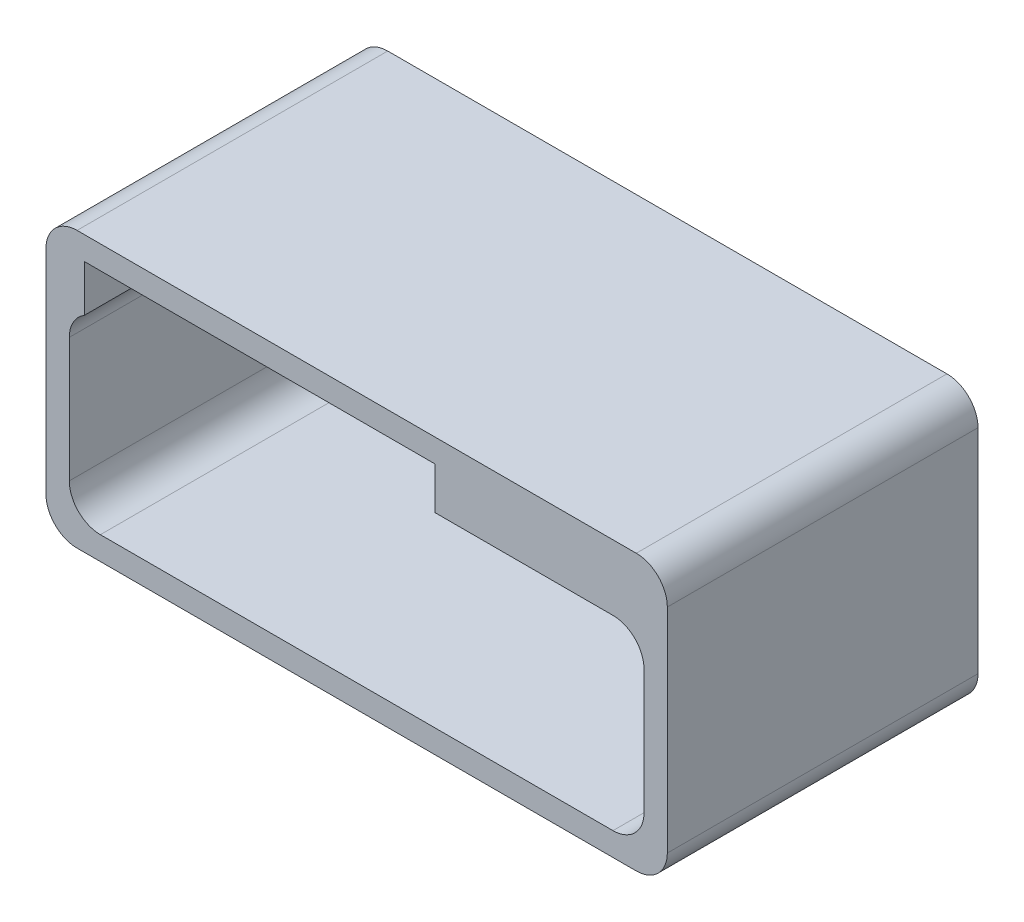
ISO-10303-21;
HEADER;
FILE_DESCRIPTION(('STEP AP214'),'2;1');
FILE_NAME('part.step','',(''),(''),'','','');
FILE_SCHEMA(('AUTOMOTIVE_DESIGN { 1 0 10303 214 1 1 1 1 }'));
ENDSEC;
DATA;
#1=APPLICATION_CONTEXT('core data for automotive mechanical design processes');
#2=APPLICATION_PROTOCOL_DEFINITION('international standard','automotive_design',2000,#1);
#3=PRODUCT_CONTEXT('',#1,'mechanical');
#4=PRODUCT('Part','Part','',(#3));
#5=PRODUCT_RELATED_PRODUCT_CATEGORY('part','',(#4));
#6=PRODUCT_DEFINITION_FORMATION('','',#4);
#7=PRODUCT_DEFINITION_CONTEXT('part definition',#1,'design');
#8=PRODUCT_DEFINITION('design','',#6,#7);
#9=PRODUCT_DEFINITION_SHAPE('','',#8);
#10=(LENGTH_UNIT() NAMED_UNIT(*) SI_UNIT(.MILLI.,.METRE.));
#11=(NAMED_UNIT(*) PLANE_ANGLE_UNIT() SI_UNIT($,.RADIAN.));
#12=(NAMED_UNIT(*) SI_UNIT($,.STERADIAN.) SOLID_ANGLE_UNIT());
#13=UNCERTAINTY_MEASURE_WITH_UNIT(LENGTH_MEASURE(1.E-05),#10,'distance_accuracy_value','');
#14=(GEOMETRIC_REPRESENTATION_CONTEXT(3) GLOBAL_UNCERTAINTY_ASSIGNED_CONTEXT((#13)) GLOBAL_UNIT_ASSIGNED_CONTEXT((#10,
#11,#12)) REPRESENTATION_CONTEXT('',''));
#15=CARTESIAN_POINT('',(0.,0.,0.));
#16=DIRECTION('',(0.,0.,1.));
#17=DIRECTION('',(1.,0.,0.));
#18=AXIS2_PLACEMENT_3D('',#15,#16,#17);
#19=CARTESIAN_POINT('',(60.3867229157518,-9.93421052631578,40.));
#20=DIRECTION('',(0.,0.,1.));
#21=DIRECTION('',(1.,0.,0.));
#22=AXIS2_PLACEMENT_3D('',#19,#20,#21);
#23=PLANE('',#22);
#24=CARTESIAN_POINT('',(60.3867229157518,-9.93421052631578,40.));
#25=DIRECTION('',(0.,0.,1.));
#26=DIRECTION('',(1.,0.,0.));
#27=AXIS2_PLACEMENT_3D('',#24,#25,#26);
#28=CIRCLE('',#27,4.);
#29=CARTESIAN_POINT('',(60.3867229157518,-13.9342105263158,40.));
#30=VERTEX_POINT('',#29);
#31=CARTESIAN_POINT('',(64.3867229157518,-9.93421052631578,40.));
#32=VERTEX_POINT('',#31);
#33=EDGE_CURVE('E296',#30,#32,#28,.T.);
#34=ORIENTED_EDGE('',*,*,#33,.T.);
#35=DIRECTION('',(0.,1.,0.));
#36=VECTOR('',#35,1.);
#37=CARTESIAN_POINT('',(64.3867229157518,17.4957894736842,40.));
#38=LINE('',#37,#36);
#39=CARTESIAN_POINT('',(64.3867229157518,17.4957894736842,40.));
#40=VERTEX_POINT('',#39);
#41=EDGE_CURVE('E300',#32,#40,#38,.T.);
#42=ORIENTED_EDGE('',*,*,#41,.T.);
#43=CARTESIAN_POINT('',(60.3867229157518,17.4957894736842,40.));
#44=DIRECTION('',(0.,0.,1.));
#45=DIRECTION('',(-1.,0.,0.));
#46=AXIS2_PLACEMENT_3D('',#43,#44,#45);
#47=CIRCLE('',#46,4.);
#48=CARTESIAN_POINT('',(60.3867229157518,21.4957894736842,40.));
#49=VERTEX_POINT('',#48);
#50=EDGE_CURVE('E304',#40,#49,#47,.T.);
#51=ORIENTED_EDGE('',*,*,#50,.T.);
#52=DIRECTION('',(-1.,0.,0.));
#53=VECTOR('',#52,1.);
#54=CARTESIAN_POINT('',(-11.6132770842482,21.4957894736842,40.));
#55=LINE('',#54,#53);
#56=CARTESIAN_POINT('',(-11.6132770842482,21.4957894736842,40.));
#57=VERTEX_POINT('',#56);
#58=EDGE_CURVE('E307',#49,#57,#55,.T.);
#59=ORIENTED_EDGE('',*,*,#58,.T.);
#60=CARTESIAN_POINT('',(-11.6132770842482,17.4957894736842,40.));
#61=DIRECTION('',(0.,0.,1.));
#62=DIRECTION('',(-1.,0.,0.));
#63=AXIS2_PLACEMENT_3D('',#60,#61,#62);
#64=CIRCLE('',#63,4.);
#65=CARTESIAN_POINT('',(-15.6132770842482,17.4957894736842,40.));
#66=VERTEX_POINT('',#65);
#67=EDGE_CURVE('E310',#57,#66,#64,.T.);
#68=ORIENTED_EDGE('',*,*,#67,.T.);
#69=DIRECTION('',(0.,-1.,0.));
#70=VECTOR('',#69,1.);
#71=CARTESIAN_POINT('',(-15.6132770842482,17.4957894736842,40.));
#72=LINE('',#71,#70);
#73=CARTESIAN_POINT('',(-15.6132770842482,-9.93421052631578,40.));
#74=VERTEX_POINT('',#73);
#75=EDGE_CURVE('E313',#66,#74,#72,.T.);
#76=ORIENTED_EDGE('',*,*,#75,.T.);
#77=CARTESIAN_POINT('',(-11.6132770842482,-9.93421052631578,40.));
#78=DIRECTION('',(0.,0.,1.));
#79=DIRECTION('',(-1.,0.,0.));
#80=AXIS2_PLACEMENT_3D('',#77,#78,#79);
#81=CIRCLE('',#80,4.);
#82=CARTESIAN_POINT('',(-11.6132770842482,-13.9342105263158,40.));
#83=VERTEX_POINT('',#82);
#84=EDGE_CURVE('E316',#74,#83,#81,.T.);
#85=ORIENTED_EDGE('',*,*,#84,.T.);
#86=DIRECTION('',(1.,0.,0.));
#87=VECTOR('',#86,1.);
#88=CARTESIAN_POINT('',(-11.6132770842482,-13.9342105263158,40.));
#89=LINE('',#88,#87);
#90=EDGE_CURVE('E319',#83,#30,#89,.T.);
#91=ORIENTED_EDGE('',*,*,#90,.T.);
#92=EDGE_LOOP('',(#34,#42,#51,#59,#68,#76,#85,#91));
#93=FACE_BOUND('',#92,.T.);
#94=DIRECTION('',(0.,-1.,0.));
#95=VECTOR('',#94,1.);
#96=CARTESIAN_POINT('',(-12.6132770842482,9.06578947368422,40.));
#97=LINE('',#96,#95);
#98=CARTESIAN_POINT('',(-12.6132770842482,9.06578947368422,40.));
#99=VERTEX_POINT('',#98);
#100=CARTESIAN_POINT('',(-12.6132770842482,-6.93421052631578,40.));
#101=VERTEX_POINT('',#100);
#102=EDGE_CURVE('E186',#99,#101,#97,.T.);
#103=ORIENTED_EDGE('',*,*,#102,.F.);
#104=CARTESIAN_POINT('',(-8.61327708424816,9.06578947368422,40.));
#105=DIRECTION('',(0.,0.,1.));
#106=DIRECTION('',(-1.,0.,0.));
#107=AXIS2_PLACEMENT_3D('',#104,#105,#106);
#108=CIRCLE('',#107,4.);
#109=CARTESIAN_POINT('',(-10.6732770842482,12.4945501827451,40.));
#110=VERTEX_POINT('',#109);
#111=EDGE_CURVE('E177',#110,#99,#108,.T.);
#112=ORIENTED_EDGE('',*,*,#111,.F.);
#113=DIRECTION('',(0.,-1.,0.));
#114=VECTOR('',#113,1.);
#115=CARTESIAN_POINT('',(-10.6732770842482,13.0657894736842,40.));
#116=LINE('',#115,#114);
#117=CARTESIAN_POINT('',(-10.6732770842482,18.4957894736842,40.));
#118=VERTEX_POINT('',#117);
#119=EDGE_CURVE('E227',#118,#110,#116,.T.);
#120=ORIENTED_EDGE('',*,*,#119,.F.);
#121=DIRECTION('',(-1.,0.,0.));
#122=VECTOR('',#121,1.);
#123=CARTESIAN_POINT('',(-10.6732770842482,18.4957894736842,40.));
#124=LINE('',#123,#122);
#125=CARTESIAN_POINT('',(34.4567229157518,18.4957894736842,40.));
#126=VERTEX_POINT('',#125);
#127=EDGE_CURVE('E224',#126,#118,#124,.T.);
#128=ORIENTED_EDGE('',*,*,#127,.F.);
#129=DIRECTION('',(0.,1.,0.));
#130=VECTOR('',#129,1.);
#131=CARTESIAN_POINT('',(34.4567229157518,18.4957894736842,40.));
#132=LINE('',#131,#130);
#133=CARTESIAN_POINT('',(34.4567229157518,13.0657894736842,40.));
#134=VERTEX_POINT('',#133);
#135=EDGE_CURVE('E221',#134,#126,#132,.T.);
#136=ORIENTED_EDGE('',*,*,#135,.F.);
#137=DIRECTION('',(-1.,0.,0.));
#138=VECTOR('',#137,1.);
#139=CARTESIAN_POINT('',(34.4567229157518,13.0657894736842,40.));
#140=LINE('',#139,#138);
#141=CARTESIAN_POINT('',(57.3867229157518,13.0657894736842,40.));
#142=VERTEX_POINT('',#141);
#143=EDGE_CURVE('E218',#142,#134,#140,.T.);
#144=ORIENTED_EDGE('',*,*,#143,.F.);
#145=CARTESIAN_POINT('',(57.3867229157518,9.06578947368422,40.));
#146=DIRECTION('',(0.,0.,1.));
#147=DIRECTION('',(1.,0.,0.));
#148=AXIS2_PLACEMENT_3D('',#145,#146,#147);
#149=CIRCLE('',#148,4.);
#150=CARTESIAN_POINT('',(61.3867229157518,9.06578947368422,40.));
#151=VERTEX_POINT('',#150);
#152=EDGE_CURVE('E215',#151,#142,#149,.T.);
#153=ORIENTED_EDGE('',*,*,#152,.F.);
#154=DIRECTION('',(0.,1.,0.));
#155=VECTOR('',#154,1.);
#156=CARTESIAN_POINT('',(61.3867229157518,9.06578947368422,40.));
#157=LINE('',#156,#155);
#158=CARTESIAN_POINT('',(61.3867229157518,-6.93421052631578,40.));
#159=VERTEX_POINT('',#158);
#160=EDGE_CURVE('E212',#159,#151,#157,.T.);
#161=ORIENTED_EDGE('',*,*,#160,.F.);
#162=CARTESIAN_POINT('',(57.3867229157518,-6.93421052631578,40.));
#163=DIRECTION('',(0.,0.,1.));
#164=DIRECTION('',(-1.,0.,0.));
#165=AXIS2_PLACEMENT_3D('',#162,#163,#164);
#166=CIRCLE('',#165,3.99999999999999);
#167=CARTESIAN_POINT('',(57.3867229157518,-10.9342105263158,40.));
#168=VERTEX_POINT('',#167);
#169=EDGE_CURVE('E209',#168,#159,#166,.T.);
#170=ORIENTED_EDGE('',*,*,#169,.F.);
#171=DIRECTION('',(1.,0.,0.));
#172=VECTOR('',#171,1.);
#173=CARTESIAN_POINT('',(-8.61327708424816,-10.9342105263158,40.));
#174=LINE('',#173,#172);
#175=CARTESIAN_POINT('',(-8.61327708424816,-10.9342105263158,40.));
#176=VERTEX_POINT('',#175);
#177=EDGE_CURVE('E204',#176,#168,#174,.T.);
#178=ORIENTED_EDGE('',*,*,#177,.F.);
#179=CARTESIAN_POINT('',(-8.61327708424816,-6.93421052631578,40.));
#180=DIRECTION('',(0.,0.,1.));
#181=DIRECTION('',(-1.,0.,0.));
#182=AXIS2_PLACEMENT_3D('',#179,#180,#181);
#183=CIRCLE('',#182,4.);
#184=EDGE_CURVE('E200',#101,#176,#183,.T.);
#185=ORIENTED_EDGE('',*,*,#184,.F.);
#186=EDGE_LOOP('',(#103,#112,#120,#128,#136,#144,#153,#161,#170,#178,#185));
#187=FACE_BOUND('',#186,.T.);
#188=ADVANCED_FACE('F45',(#93,#187),#23,.T.);
#189=CARTESIAN_POINT('',(60.3867229157518,-9.93421052631578,0.));
#190=DIRECTION('',(0.,0.,1.));
#191=DIRECTION('',(1.,0.,0.));
#192=AXIS2_PLACEMENT_3D('',#189,#190,#191);
#193=PLANE('',#192);
#194=CARTESIAN_POINT('',(60.3867229157518,-9.93421052631578,0.));
#195=DIRECTION('',(0.,0.,1.));
#196=DIRECTION('',(1.,0.,0.));
#197=AXIS2_PLACEMENT_3D('',#194,#195,#196);
#198=CIRCLE('',#197,4.);
#199=CARTESIAN_POINT('',(60.3867229157518,-13.9342105263158,0.));
#200=VERTEX_POINT('',#199);
#201=CARTESIAN_POINT('',(64.3867229157518,-9.93421052631578,0.));
#202=VERTEX_POINT('',#201);
#203=EDGE_CURVE('E195',#200,#202,#198,.T.);
#204=ORIENTED_EDGE('',*,*,#203,.F.);
#205=DIRECTION('',(1.,0.,0.));
#206=VECTOR('',#205,1.);
#207=CARTESIAN_POINT('',(-11.6132770842482,-13.9342105263158,0.));
#208=LINE('',#207,#206);
#209=CARTESIAN_POINT('',(-11.6132770842482,-13.9342105263158,0.));
#210=VERTEX_POINT('',#209);
#211=EDGE_CURVE('E301',#210,#200,#208,.T.);
#212=ORIENTED_EDGE('',*,*,#211,.F.);
#213=CARTESIAN_POINT('',(-11.6132770842482,-9.93421052631578,0.));
#214=DIRECTION('',(0.,0.,1.));
#215=DIRECTION('',(-1.,0.,0.));
#216=AXIS2_PLACEMENT_3D('',#213,#214,#215);
#217=CIRCLE('',#216,4.);
#218=CARTESIAN_POINT('',(-15.6132770842482,-9.93421052631578,0.));
#219=VERTEX_POINT('',#218);
#220=EDGE_CURVE('E341',#219,#210,#217,.T.);
#221=ORIENTED_EDGE('',*,*,#220,.F.);
#222=DIRECTION('',(0.,-1.,0.));
#223=VECTOR('',#222,1.);
#224=CARTESIAN_POINT('',(-15.6132770842482,17.4957894736842,0.));
#225=LINE('',#224,#223);
#226=CARTESIAN_POINT('',(-15.6132770842482,17.4957894736842,0.));
#227=VERTEX_POINT('',#226);
#228=EDGE_CURVE('E338',#227,#219,#225,.T.);
#229=ORIENTED_EDGE('',*,*,#228,.F.);
#230=CARTESIAN_POINT('',(-11.6132770842482,17.4957894736842,0.));
#231=DIRECTION('',(0.,0.,1.));
#232=DIRECTION('',(-1.,0.,0.));
#233=AXIS2_PLACEMENT_3D('',#230,#231,#232);
#234=CIRCLE('',#233,4.);
#235=CARTESIAN_POINT('',(-11.6132770842482,21.4957894736842,0.));
#236=VERTEX_POINT('',#235);
#237=EDGE_CURVE('E335',#236,#227,#234,.T.);
#238=ORIENTED_EDGE('',*,*,#237,.F.);
#239=DIRECTION('',(-1.,0.,0.));
#240=VECTOR('',#239,1.);
#241=CARTESIAN_POINT('',(-11.6132770842482,21.4957894736842,0.));
#242=LINE('',#241,#240);
#243=CARTESIAN_POINT('',(60.3867229157518,21.4957894736842,0.));
#244=VERTEX_POINT('',#243);
#245=EDGE_CURVE('E332',#244,#236,#242,.T.);
#246=ORIENTED_EDGE('',*,*,#245,.F.);
#247=CARTESIAN_POINT('',(60.3867229157518,17.4957894736842,0.));
#248=DIRECTION('',(0.,0.,1.));
#249=DIRECTION('',(-1.,0.,0.));
#250=AXIS2_PLACEMENT_3D('',#247,#248,#249);
#251=CIRCLE('',#250,4.);
#252=CARTESIAN_POINT('',(64.3867229157518,17.4957894736842,0.));
#253=VERTEX_POINT('',#252);
#254=EDGE_CURVE('E329',#253,#244,#251,.T.);
#255=ORIENTED_EDGE('',*,*,#254,.F.);
#256=DIRECTION('',(0.,1.,0.));
#257=VECTOR('',#256,1.);
#258=CARTESIAN_POINT('',(64.3867229157518,17.4957894736842,0.));
#259=LINE('',#258,#257);
#260=EDGE_CURVE('E326',#202,#253,#259,.T.);
#261=ORIENTED_EDGE('',*,*,#260,.F.);
#262=EDGE_LOOP('',(#204,#212,#221,#229,#238,#246,#255,#261));
#263=FACE_BOUND('',#262,.T.);
#264=CARTESIAN_POINT('',(-8.61327708424816,9.06578947368422,0.));
#265=DIRECTION('',(0.,0.,1.));
#266=DIRECTION('',(-1.,0.,0.));
#267=AXIS2_PLACEMENT_3D('',#264,#265,#266);
#268=CIRCLE('',#267,4.);
#269=CARTESIAN_POINT('',(-10.6732770842482,12.4945501827451,0.));
#270=VERTEX_POINT('',#269);
#271=CARTESIAN_POINT('',(-12.6132770842482,9.06578947368422,0.));
#272=VERTEX_POINT('',#271);
#273=EDGE_CURVE('E69',#270,#272,#268,.T.);
#274=ORIENTED_EDGE('',*,*,#273,.T.);
#275=DIRECTION('',(0.,-1.,0.));
#276=VECTOR('',#275,1.);
#277=CARTESIAN_POINT('',(-12.6132770842482,9.06578947368422,0.));
#278=LINE('',#277,#276);
#279=CARTESIAN_POINT('',(-12.6132770842482,-6.93421052631578,0.));
#280=VERTEX_POINT('',#279);
#281=EDGE_CURVE('E193',#272,#280,#278,.T.);
#282=ORIENTED_EDGE('',*,*,#281,.T.);
#283=CARTESIAN_POINT('',(-8.61327708424816,-6.93421052631578,0.));
#284=DIRECTION('',(0.,0.,1.));
#285=DIRECTION('',(-1.,0.,0.));
#286=AXIS2_PLACEMENT_3D('',#283,#284,#285);
#287=CIRCLE('',#286,4.);
#288=CARTESIAN_POINT('',(-8.61327708424816,-10.9342105263158,0.));
#289=VERTEX_POINT('',#288);
#290=EDGE_CURVE('E234',#280,#289,#287,.T.);
#291=ORIENTED_EDGE('',*,*,#290,.T.);
#292=DIRECTION('',(1.,0.,0.));
#293=VECTOR('',#292,1.);
#294=CARTESIAN_POINT('',(-8.61327708424816,-10.9342105263158,0.));
#295=LINE('',#294,#293);
#296=CARTESIAN_POINT('',(57.3867229157518,-10.9342105263158,0.));
#297=VERTEX_POINT('',#296);
#298=EDGE_CURVE('E238',#289,#297,#295,.T.);
#299=ORIENTED_EDGE('',*,*,#298,.T.);
#300=CARTESIAN_POINT('',(57.3867229157518,-6.93421052631578,0.));
#301=DIRECTION('',(0.,0.,1.));
#302=DIRECTION('',(-1.,0.,0.));
#303=AXIS2_PLACEMENT_3D('',#300,#301,#302);
#304=CIRCLE('',#303,3.99999999999999);
#305=CARTESIAN_POINT('',(61.3867229157518,-6.93421052631578,0.));
#306=VERTEX_POINT('',#305);
#307=EDGE_CURVE('E242',#297,#306,#304,.T.);
#308=ORIENTED_EDGE('',*,*,#307,.T.);
#309=DIRECTION('',(0.,1.,0.));
#310=VECTOR('',#309,1.);
#311=CARTESIAN_POINT('',(61.3867229157518,9.06578947368422,0.));
#312=LINE('',#311,#310);
#313=CARTESIAN_POINT('',(61.3867229157518,9.06578947368422,0.));
#314=VERTEX_POINT('',#313);
#315=EDGE_CURVE('E246',#306,#314,#312,.T.);
#316=ORIENTED_EDGE('',*,*,#315,.T.);
#317=CARTESIAN_POINT('',(57.3867229157518,9.06578947368422,0.));
#318=DIRECTION('',(0.,0.,1.));
#319=DIRECTION('',(1.,0.,0.));
#320=AXIS2_PLACEMENT_3D('',#317,#318,#319);
#321=CIRCLE('',#320,4.);
#322=CARTESIAN_POINT('',(57.3867229157518,13.0657894736842,0.));
#323=VERTEX_POINT('',#322);
#324=EDGE_CURVE('E250',#314,#323,#321,.T.);
#325=ORIENTED_EDGE('',*,*,#324,.T.);
#326=DIRECTION('',(-1.,0.,0.));
#327=VECTOR('',#326,1.);
#328=CARTESIAN_POINT('',(34.4567229157518,13.0657894736842,0.));
#329=LINE('',#328,#327);
#330=CARTESIAN_POINT('',(34.4567229157518,13.0657894736842,0.));
#331=VERTEX_POINT('',#330);
#332=EDGE_CURVE('E254',#323,#331,#329,.T.);
#333=ORIENTED_EDGE('',*,*,#332,.T.);
#334=DIRECTION('',(0.,1.,0.));
#335=VECTOR('',#334,1.);
#336=CARTESIAN_POINT('',(34.4567229157518,18.4957894736842,0.));
#337=LINE('',#336,#335);
#338=CARTESIAN_POINT('',(34.4567229157518,18.4957894736842,0.));
#339=VERTEX_POINT('',#338);
#340=EDGE_CURVE('E258',#331,#339,#337,.T.);
#341=ORIENTED_EDGE('',*,*,#340,.T.);
#342=DIRECTION('',(-1.,0.,0.));
#343=VECTOR('',#342,1.);
#344=CARTESIAN_POINT('',(-10.6732770842482,18.4957894736842,0.));
#345=LINE('',#344,#343);
#346=CARTESIAN_POINT('',(-10.6732770842482,18.4957894736842,0.));
#347=VERTEX_POINT('',#346);
#348=EDGE_CURVE('E262',#339,#347,#345,.T.);
#349=ORIENTED_EDGE('',*,*,#348,.T.);
#350=DIRECTION('',(0.,-1.,0.));
#351=VECTOR('',#350,1.);
#352=CARTESIAN_POINT('',(-10.6732770842482,13.0657894736842,0.));
#353=LINE('',#352,#351);
#354=EDGE_CURVE('E187',#347,#270,#353,.T.);
#355=ORIENTED_EDGE('',*,*,#354,.T.);
#356=EDGE_LOOP('',(#274,#282,#291,#299,#308,#316,#325,#333,#341,#349,#355));
#357=FACE_BOUND('',#356,.T.);
#358=ADVANCED_FACE('F380',(#263,#357),#193,.F.);
#359=CARTESIAN_POINT('',(60.3867229157518,-9.93421052631578,40.));
#360=DIRECTION('',(0.,0.,-1.));
#361=DIRECTION('',(-1.,0.,0.));
#362=AXIS2_PLACEMENT_3D('',#359,#360,#361);
#363=CYLINDRICAL_SURFACE('',#362,4.);
#364=ORIENTED_EDGE('',*,*,#203,.T.);
#365=DIRECTION('',(0.,0.,-1.));
#366=VECTOR('',#365,1.);
#367=CARTESIAN_POINT('',(64.3867229157518,-9.93421052631578,40.));
#368=LINE('',#367,#366);
#369=EDGE_CURVE('E11',#32,#202,#368,.T.);
#370=ORIENTED_EDGE('',*,*,#369,.F.);
#371=ORIENTED_EDGE('',*,*,#33,.F.);
#372=DIRECTION('',(0.,0.,-1.));
#373=VECTOR('',#372,1.);
#374=CARTESIAN_POINT('',(60.3867229157518,-13.9342105263158,40.));
#375=LINE('',#374,#373);
#376=EDGE_CURVE('E322',#30,#200,#375,.T.);
#377=ORIENTED_EDGE('',*,*,#376,.T.);
#378=EDGE_LOOP('',(#364,#370,#371,#377));
#379=FACE_BOUND('',#378,.T.);
#380=ADVANCED_FACE('F47',(#379),#363,.T.);
#381=CARTESIAN_POINT('',(64.3867229157518,17.4957894736842,40.));
#382=DIRECTION('',(-1.,0.,0.));
#383=DIRECTION('',(0.,0.,1.));
#384=AXIS2_PLACEMENT_3D('',#381,#382,#383);
#385=PLANE('',#384);
#386=ORIENTED_EDGE('',*,*,#260,.T.);
#387=DIRECTION('',(0.,0.,-1.));
#388=VECTOR('',#387,1.);
#389=CARTESIAN_POINT('',(64.3867229157518,17.4957894736842,40.));
#390=LINE('',#389,#388);
#391=EDGE_CURVE('E54',#40,#253,#390,.T.);
#392=ORIENTED_EDGE('',*,*,#391,.F.);
#393=ORIENTED_EDGE('',*,*,#41,.F.);
#394=ORIENTED_EDGE('',*,*,#369,.T.);
#395=EDGE_LOOP('',(#386,#392,#393,#394));
#396=FACE_BOUND('',#395,.T.);
#397=ADVANCED_FACE('F397',(#396),#385,.F.);
#398=CARTESIAN_POINT('',(60.3867229157518,17.4957894736842,40.));
#399=DIRECTION('',(0.,0.,-1.));
#400=DIRECTION('',(-1.,0.,0.));
#401=AXIS2_PLACEMENT_3D('',#398,#399,#400);
#402=CYLINDRICAL_SURFACE('',#401,4.);
#403=ORIENTED_EDGE('',*,*,#254,.T.);
#404=DIRECTION('',(0.,0.,-1.));
#405=VECTOR('',#404,1.);
#406=CARTESIAN_POINT('',(60.3867229157518,21.4957894736842,40.));
#407=LINE('',#406,#405);
#408=EDGE_CURVE('E365',#49,#244,#407,.T.);
#409=ORIENTED_EDGE('',*,*,#408,.F.);
#410=ORIENTED_EDGE('',*,*,#50,.F.);
#411=ORIENTED_EDGE('',*,*,#391,.T.);
#412=EDGE_LOOP('',(#403,#409,#410,#411));
#413=FACE_BOUND('',#412,.T.);
#414=ADVANCED_FACE('F374',(#413),#402,.T.);
#415=CARTESIAN_POINT('',(-11.6132770842482,21.4957894736842,40.));
#416=DIRECTION('',(0.,-1.,0.));
#417=DIRECTION('',(0.,0.,-1.));
#418=AXIS2_PLACEMENT_3D('',#415,#416,#417);
#419=PLANE('',#418);
#420=ORIENTED_EDGE('',*,*,#245,.T.);
#421=DIRECTION('',(0.,0.,-1.));
#422=VECTOR('',#421,1.);
#423=CARTESIAN_POINT('',(-11.6132770842482,21.4957894736842,40.));
#424=LINE('',#423,#422);
#425=EDGE_CURVE('E361',#57,#236,#424,.T.);
#426=ORIENTED_EDGE('',*,*,#425,.F.);
#427=ORIENTED_EDGE('',*,*,#58,.F.);
#428=ORIENTED_EDGE('',*,*,#408,.T.);
#429=EDGE_LOOP('',(#420,#426,#427,#428));
#430=FACE_BOUND('',#429,.T.);
#431=ADVANCED_FACE('F386',(#430),#419,.F.);
#432=CARTESIAN_POINT('',(-11.6132770842482,17.4957894736842,40.));
#433=DIRECTION('',(0.,0.,-1.));
#434=DIRECTION('',(-1.,0.,0.));
#435=AXIS2_PLACEMENT_3D('',#432,#433,#434);
#436=CYLINDRICAL_SURFACE('',#435,4.);
#437=ORIENTED_EDGE('',*,*,#237,.T.);
#438=DIRECTION('',(0.,0.,-1.));
#439=VECTOR('',#438,1.);
#440=CARTESIAN_POINT('',(-15.6132770842482,17.4957894736842,40.));
#441=LINE('',#440,#439);
#442=EDGE_CURVE('E357',#66,#227,#441,.T.);
#443=ORIENTED_EDGE('',*,*,#442,.F.);
#444=ORIENTED_EDGE('',*,*,#67,.F.);
#445=ORIENTED_EDGE('',*,*,#425,.T.);
#446=EDGE_LOOP('',(#437,#443,#444,#445));
#447=FACE_BOUND('',#446,.T.);
#448=ADVANCED_FACE('F390',(#447),#436,.T.);
#449=CARTESIAN_POINT('',(-15.6132770842482,17.4957894736842,40.));
#450=DIRECTION('',(1.,0.,0.));
#451=DIRECTION('',(0.,1.,0.));
#452=AXIS2_PLACEMENT_3D('',#449,#450,#451);
#453=PLANE('',#452);
#454=ORIENTED_EDGE('',*,*,#228,.T.);
#455=DIRECTION('',(0.,0.,-1.));
#456=VECTOR('',#455,1.);
#457=CARTESIAN_POINT('',(-15.6132770842482,-9.93421052631578,40.));
#458=LINE('',#457,#456);
#459=EDGE_CURVE('E353',#74,#219,#458,.T.);
#460=ORIENTED_EDGE('',*,*,#459,.F.);
#461=ORIENTED_EDGE('',*,*,#75,.F.);
#462=ORIENTED_EDGE('',*,*,#442,.T.);
#463=EDGE_LOOP('',(#454,#460,#461,#462));
#464=FACE_BOUND('',#463,.T.);
#465=ADVANCED_FACE('F410',(#464),#453,.F.);
#466=CARTESIAN_POINT('',(-11.6132770842482,-9.93421052631578,40.));
#467=DIRECTION('',(0.,0.,-1.));
#468=DIRECTION('',(-1.,0.,0.));
#469=AXIS2_PLACEMENT_3D('',#466,#467,#468);
#470=CYLINDRICAL_SURFACE('',#469,4.);
#471=ORIENTED_EDGE('',*,*,#220,.T.);
#472=DIRECTION('',(0.,0.,-1.));
#473=VECTOR('',#472,1.);
#474=CARTESIAN_POINT('',(-11.6132770842482,-13.9342105263158,40.));
#475=LINE('',#474,#473);
#476=EDGE_CURVE('E349',#83,#210,#475,.T.);
#477=ORIENTED_EDGE('',*,*,#476,.F.);
#478=ORIENTED_EDGE('',*,*,#84,.F.);
#479=ORIENTED_EDGE('',*,*,#459,.T.);
#480=EDGE_LOOP('',(#471,#477,#478,#479));
#481=FACE_BOUND('',#480,.T.);
#482=ADVANCED_FACE('F408',(#481),#470,.T.);
#483=CARTESIAN_POINT('',(-11.6132770842482,-13.9342105263158,40.));
#484=DIRECTION('',(0.,1.,0.));
#485=DIRECTION('',(0.,0.,1.));
#486=AXIS2_PLACEMENT_3D('',#483,#484,#485);
#487=PLANE('',#486);
#488=ORIENTED_EDGE('',*,*,#211,.T.);
#489=ORIENTED_EDGE('',*,*,#376,.F.);
#490=ORIENTED_EDGE('',*,*,#90,.F.);
#491=ORIENTED_EDGE('',*,*,#476,.T.);
#492=EDGE_LOOP('',(#488,#489,#490,#491));
#493=FACE_BOUND('',#492,.T.);
#494=ADVANCED_FACE('F403',(#493),#487,.F.);
#495=CARTESIAN_POINT('',(-8.61327708424816,9.06578947368422,40.));
#496=DIRECTION('',(0.,0.,-1.));
#497=DIRECTION('',(-1.,0.,0.));
#498=AXIS2_PLACEMENT_3D('',#495,#496,#497);
#499=CYLINDRICAL_SURFACE('',#498,4.);
#500=ORIENTED_EDGE('',*,*,#273,.F.);
#501=DIRECTION('',(0.,0.,-1.));
#502=VECTOR('',#501,1.);
#503=CARTESIAN_POINT('',(-10.6732770842482,12.4945501827451,40.));
#504=LINE('',#503,#502);
#505=EDGE_CURVE('E181',#110,#270,#504,.T.);
#506=ORIENTED_EDGE('',*,*,#505,.F.);
#507=ORIENTED_EDGE('',*,*,#111,.T.);
#508=DIRECTION('',(0.,0.,-1.));
#509=VECTOR('',#508,1.);
#510=CARTESIAN_POINT('',(-12.6132770842482,9.06578947368422,40.));
#511=LINE('',#510,#509);
#512=EDGE_CURVE('E180',#99,#272,#511,.T.);
#513=ORIENTED_EDGE('',*,*,#512,.T.);
#514=EDGE_LOOP('',(#500,#506,#507,#513));
#515=FACE_BOUND('',#514,.T.);
#516=ADVANCED_FACE('F179',(#515),#499,.F.);
#517=CARTESIAN_POINT('',(-12.6132770842482,9.06578947368422,40.));
#518=DIRECTION('',(1.,0.,0.));
#519=DIRECTION('',(0.,1.,0.));
#520=AXIS2_PLACEMENT_3D('',#517,#518,#519);
#521=PLANE('',#520);
#522=ORIENTED_EDGE('',*,*,#281,.F.);
#523=ORIENTED_EDGE('',*,*,#512,.F.);
#524=ORIENTED_EDGE('',*,*,#102,.T.);
#525=DIRECTION('',(0.,0.,-1.));
#526=VECTOR('',#525,1.);
#527=CARTESIAN_POINT('',(-12.6132770842482,-6.93421052631578,40.));
#528=LINE('',#527,#526);
#529=EDGE_CURVE('E196',#101,#280,#528,.T.);
#530=ORIENTED_EDGE('',*,*,#529,.T.);
#531=EDGE_LOOP('',(#522,#523,#524,#530));
#532=FACE_BOUND('',#531,.T.);
#533=ADVANCED_FACE('F190',(#532),#521,.T.);
#534=CARTESIAN_POINT('',(-8.61327708424816,-6.93421052631578,40.));
#535=DIRECTION('',(0.,0.,-1.));
#536=DIRECTION('',(-1.,0.,0.));
#537=AXIS2_PLACEMENT_3D('',#534,#535,#536);
#538=CYLINDRICAL_SURFACE('',#537,4.);
#539=ORIENTED_EDGE('',*,*,#290,.F.);
#540=ORIENTED_EDGE('',*,*,#529,.F.);
#541=ORIENTED_EDGE('',*,*,#184,.T.);
#542=DIRECTION('',(0.,0.,-1.));
#543=VECTOR('',#542,1.);
#544=CARTESIAN_POINT('',(-8.61327708424816,-10.9342105263158,40.));
#545=LINE('',#544,#543);
#546=EDGE_CURVE('E291',#176,#289,#545,.T.);
#547=ORIENTED_EDGE('',*,*,#546,.T.);
#548=EDGE_LOOP('',(#539,#540,#541,#547));
#549=FACE_BOUND('',#548,.T.);
#550=ADVANCED_FACE('F435',(#549),#538,.F.);
#551=CARTESIAN_POINT('',(-8.61327708424816,-10.9342105263158,40.));
#552=DIRECTION('',(0.,1.,0.));
#553=DIRECTION('',(-1.,0.,0.));
#554=AXIS2_PLACEMENT_3D('',#551,#552,#553);
#555=PLANE('',#554);
#556=ORIENTED_EDGE('',*,*,#298,.F.);
#557=ORIENTED_EDGE('',*,*,#546,.F.);
#558=ORIENTED_EDGE('',*,*,#177,.T.);
#559=DIRECTION('',(0.,0.,-1.));
#560=VECTOR('',#559,1.);
#561=CARTESIAN_POINT('',(57.3867229157518,-10.9342105263158,40.));
#562=LINE('',#561,#560);
#563=EDGE_CURVE('E288',#168,#297,#562,.T.);
#564=ORIENTED_EDGE('',*,*,#563,.T.);
#565=EDGE_LOOP('',(#556,#557,#558,#564));
#566=FACE_BOUND('',#565,.T.);
#567=ADVANCED_FACE('F439',(#566),#555,.T.);
#568=CARTESIAN_POINT('',(57.3867229157518,-6.93421052631578,40.));
#569=DIRECTION('',(0.,0.,-1.));
#570=DIRECTION('',(-1.,0.,0.));
#571=AXIS2_PLACEMENT_3D('',#568,#569,#570);
#572=CYLINDRICAL_SURFACE('',#571,3.99999999999999);
#573=ORIENTED_EDGE('',*,*,#307,.F.);
#574=ORIENTED_EDGE('',*,*,#563,.F.);
#575=ORIENTED_EDGE('',*,*,#169,.T.);
#576=DIRECTION('',(0.,0.,-1.));
#577=VECTOR('',#576,1.);
#578=CARTESIAN_POINT('',(61.3867229157518,-6.93421052631578,40.));
#579=LINE('',#578,#577);
#580=EDGE_CURVE('E285',#159,#306,#579,.T.);
#581=ORIENTED_EDGE('',*,*,#580,.T.);
#582=EDGE_LOOP('',(#573,#574,#575,#581));
#583=FACE_BOUND('',#582,.T.);
#584=ADVANCED_FACE('F445',(#583),#572,.F.);
#585=CARTESIAN_POINT('',(61.3867229157518,9.06578947368422,40.));
#586=DIRECTION('',(-1.,0.,0.));
#587=DIRECTION('',(0.,-1.,0.));
#588=AXIS2_PLACEMENT_3D('',#585,#586,#587);
#589=PLANE('',#588);
#590=ORIENTED_EDGE('',*,*,#315,.F.);
#591=ORIENTED_EDGE('',*,*,#580,.F.);
#592=ORIENTED_EDGE('',*,*,#160,.T.);
#593=DIRECTION('',(0.,0.,-1.));
#594=VECTOR('',#593,1.);
#595=CARTESIAN_POINT('',(61.3867229157518,9.06578947368422,40.));
#596=LINE('',#595,#594);
#597=EDGE_CURVE('E282',#151,#314,#596,.T.);
#598=ORIENTED_EDGE('',*,*,#597,.T.);
#599=EDGE_LOOP('',(#590,#591,#592,#598));
#600=FACE_BOUND('',#599,.T.);
#601=ADVANCED_FACE('F449',(#600),#589,.T.);
#602=CARTESIAN_POINT('',(57.3867229157518,9.06578947368422,40.));
#603=DIRECTION('',(0.,0.,-1.));
#604=DIRECTION('',(-1.,0.,0.));
#605=AXIS2_PLACEMENT_3D('',#602,#603,#604);
#606=CYLINDRICAL_SURFACE('',#605,4.);
#607=ORIENTED_EDGE('',*,*,#324,.F.);
#608=ORIENTED_EDGE('',*,*,#597,.F.);
#609=ORIENTED_EDGE('',*,*,#152,.T.);
#610=DIRECTION('',(0.,0.,-1.));
#611=VECTOR('',#610,1.);
#612=CARTESIAN_POINT('',(57.3867229157518,13.0657894736842,40.));
#613=LINE('',#612,#611);
#614=EDGE_CURVE('E279',#142,#323,#613,.T.);
#615=ORIENTED_EDGE('',*,*,#614,.T.);
#616=EDGE_LOOP('',(#607,#608,#609,#615));
#617=FACE_BOUND('',#616,.T.);
#618=ADVANCED_FACE('F453',(#617),#606,.F.);
#619=CARTESIAN_POINT('',(34.4567229157518,13.0657894736842,40.));
#620=DIRECTION('',(0.,-1.,0.));
#621=DIRECTION('',(1.,0.,0.));
#622=AXIS2_PLACEMENT_3D('',#619,#620,#621);
#623=PLANE('',#622);
#624=ORIENTED_EDGE('',*,*,#332,.F.);
#625=ORIENTED_EDGE('',*,*,#614,.F.);
#626=ORIENTED_EDGE('',*,*,#143,.T.);
#627=DIRECTION('',(0.,0.,-1.));
#628=VECTOR('',#627,1.);
#629=CARTESIAN_POINT('',(34.4567229157518,13.0657894736842,40.));
#630=LINE('',#629,#628);
#631=EDGE_CURVE('E276',#134,#331,#630,.T.);
#632=ORIENTED_EDGE('',*,*,#631,.T.);
#633=EDGE_LOOP('',(#624,#625,#626,#632));
#634=FACE_BOUND('',#633,.T.);
#635=ADVANCED_FACE('F457',(#634),#623,.T.);
#636=CARTESIAN_POINT('',(34.4567229157518,18.4957894736842,40.));
#637=DIRECTION('',(-1.,0.,0.));
#638=DIRECTION('',(0.,0.,1.));
#639=AXIS2_PLACEMENT_3D('',#636,#637,#638);
#640=PLANE('',#639);
#641=ORIENTED_EDGE('',*,*,#340,.F.);
#642=ORIENTED_EDGE('',*,*,#631,.F.);
#643=ORIENTED_EDGE('',*,*,#135,.T.);
#644=DIRECTION('',(0.,0.,-1.));
#645=VECTOR('',#644,1.);
#646=CARTESIAN_POINT('',(34.4567229157518,18.4957894736842,40.));
#647=LINE('',#646,#645);
#648=EDGE_CURVE('E273',#126,#339,#647,.T.);
#649=ORIENTED_EDGE('',*,*,#648,.T.);
#650=EDGE_LOOP('',(#641,#642,#643,#649));
#651=FACE_BOUND('',#650,.T.);
#652=ADVANCED_FACE('F461',(#651),#640,.T.);
#653=CARTESIAN_POINT('',(-10.6732770842482,18.4957894736842,40.));
#654=DIRECTION('',(0.,-1.,0.));
#655=DIRECTION('',(0.,0.,-1.));
#656=AXIS2_PLACEMENT_3D('',#653,#654,#655);
#657=PLANE('',#656);
#658=ORIENTED_EDGE('',*,*,#348,.F.);
#659=ORIENTED_EDGE('',*,*,#648,.F.);
#660=ORIENTED_EDGE('',*,*,#127,.T.);
#661=DIRECTION('',(0.,0.,-1.));
#662=VECTOR('',#661,1.);
#663=CARTESIAN_POINT('',(-10.6732770842482,18.4957894736842,40.));
#664=LINE('',#663,#662);
#665=EDGE_CURVE('E61',#118,#347,#664,.T.);
#666=ORIENTED_EDGE('',*,*,#665,.T.);
#667=EDGE_LOOP('',(#658,#659,#660,#666));
#668=FACE_BOUND('',#667,.T.);
#669=ADVANCED_FACE('F465',(#668),#657,.T.);
#670=CARTESIAN_POINT('',(-10.6732770842482,13.0657894736842,40.));
#671=DIRECTION('',(1.,0.,0.));
#672=DIRECTION('',(0.,0.,-1.));
#673=AXIS2_PLACEMENT_3D('',#670,#671,#672);
#674=PLANE('',#673);
#675=ORIENTED_EDGE('',*,*,#354,.F.);
#676=ORIENTED_EDGE('',*,*,#665,.F.);
#677=ORIENTED_EDGE('',*,*,#119,.T.);
#678=ORIENTED_EDGE('',*,*,#505,.T.);
#679=EDGE_LOOP('',(#675,#676,#677,#678));
#680=FACE_BOUND('',#679,.T.);
#681=ADVANCED_FACE('F469',(#680),#674,.T.);
#682=CLOSED_SHELL('',(#188,#358,#380,#397,#414,#431,#448,#465,#482,#494,#516,#533,#550,#567,
#584,#601,#618,#635,#652,#669,#681));
#683=MANIFOLD_SOLID_BREP('B2',#682);
#684=ADVANCED_BREP_SHAPE_REPRESENTATION('',(#18,#683),#14);
#685=SHAPE_DEFINITION_REPRESENTATION(#9,#684);
ENDSEC;
END-ISO-10303-21;
